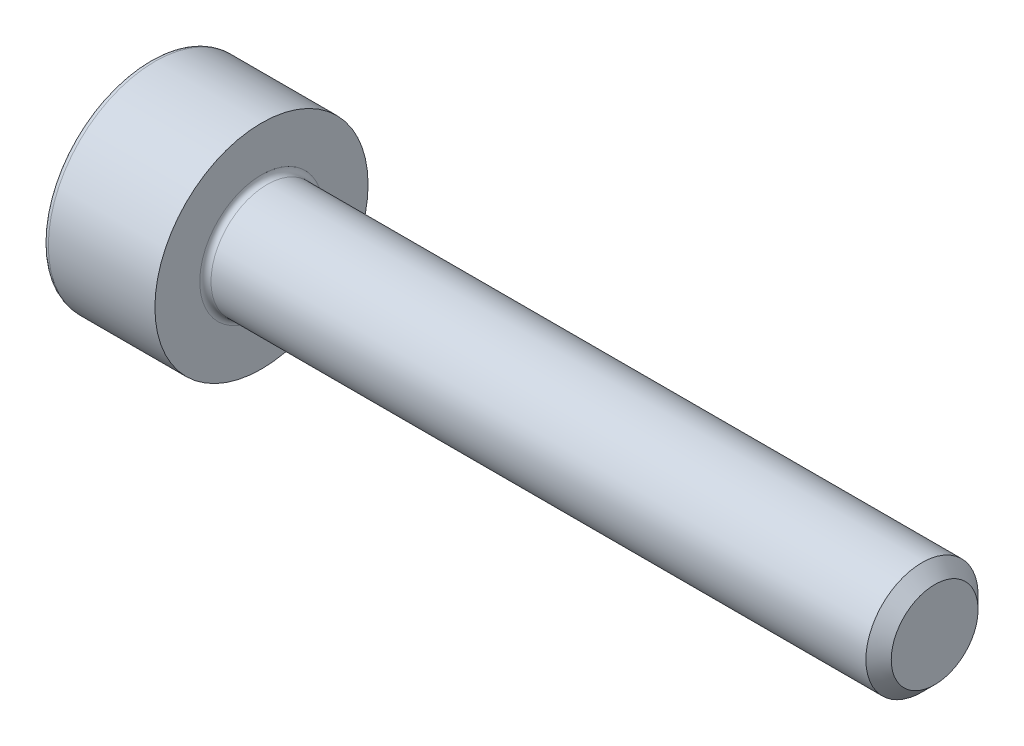
ISO-10303-21;
HEADER;
FILE_DESCRIPTION(('STEP AP214'),'2;1');
FILE_NAME('part.step','',(''),(''),'','','');
FILE_SCHEMA(('AUTOMOTIVE_DESIGN { 1 0 10303 214 1 1 1 1 }'));
ENDSEC;
DATA;
#1=APPLICATION_CONTEXT('core data for automotive mechanical design processes');
#2=APPLICATION_PROTOCOL_DEFINITION('international standard','automotive_design',2000,#1);
#3=PRODUCT_CONTEXT('',#1,'mechanical');
#4=PRODUCT('Part','Part','',(#3));
#5=PRODUCT_RELATED_PRODUCT_CATEGORY('part','',(#4));
#6=PRODUCT_DEFINITION_FORMATION('','',#4);
#7=PRODUCT_DEFINITION_CONTEXT('part definition',#1,'design');
#8=PRODUCT_DEFINITION('design','',#6,#7);
#9=PRODUCT_DEFINITION_SHAPE('','',#8);
#10=(LENGTH_UNIT() NAMED_UNIT(*) SI_UNIT(.MILLI.,.METRE.));
#11=(NAMED_UNIT(*) PLANE_ANGLE_UNIT() SI_UNIT($,.RADIAN.));
#12=(NAMED_UNIT(*) SI_UNIT($,.STERADIAN.) SOLID_ANGLE_UNIT());
#13=UNCERTAINTY_MEASURE_WITH_UNIT(LENGTH_MEASURE(1.E-05),#10,'distance_accuracy_value','');
#14=(GEOMETRIC_REPRESENTATION_CONTEXT(3) GLOBAL_UNCERTAINTY_ASSIGNED_CONTEXT((#13)) GLOBAL_UNIT_ASSIGNED_CONTEXT((#10,
#11,#12)) REPRESENTATION_CONTEXT('',''));
#15=CARTESIAN_POINT('',(0.,0.,0.));
#16=DIRECTION('',(0.,0.,1.));
#17=DIRECTION('',(1.,0.,0.));
#18=AXIS2_PLACEMENT_3D('',#15,#16,#17);
#19=CARTESIAN_POINT('',(0.,0.,0.));
#20=DIRECTION('',(-1.,0.,0.));
#21=DIRECTION('',(0.,0.,1.));
#22=AXIS2_PLACEMENT_3D('',#19,#20,#21);
#23=PLANE('',#22);
#24=DIRECTION('',(0.,-0.5,0.86602540378444));
#25=VECTOR('',#24,1.);
#26=CARTESIAN_POINT('',(0.,0.892006165897967,0.));
#27=LINE('',#26,#25);
#28=CARTESIAN_POINT('',(0.,0.892006165897967,0.));
#29=VERTEX_POINT('',#28);
#30=CARTESIAN_POINT('',(0.,0.446003082948983,0.7725));
#31=VERTEX_POINT('',#30);
#32=EDGE_CURVE('E245',#29,#31,#27,.T.);
#33=ORIENTED_EDGE('',*,*,#32,.T.);
#34=DIRECTION('',(0.,1.,0.));
#35=VECTOR('',#34,1.);
#36=CARTESIAN_POINT('',(0.,-0.446003082948988,0.7725));
#37=LINE('',#36,#35);
#38=CARTESIAN_POINT('',(0.,-0.446003082948988,0.7725));
#39=VERTEX_POINT('',#38);
#40=EDGE_CURVE('E112',#39,#31,#37,.T.);
#41=ORIENTED_EDGE('',*,*,#40,.F.);
#42=DIRECTION('',(0.,-0.5,-0.866025403784438));
#43=VECTOR('',#42,1.);
#44=CARTESIAN_POINT('',(0.,-0.446003082948988,0.7725));
#45=LINE('',#44,#43);
#46=CARTESIAN_POINT('',(0.,-0.892006165897975,0.));
#47=VERTEX_POINT('',#46);
#48=EDGE_CURVE('E248',#39,#47,#45,.T.);
#49=ORIENTED_EDGE('',*,*,#48,.T.);
#50=DIRECTION('',(0.,0.5,-0.86602540378444));
#51=VECTOR('',#50,1.);
#52=CARTESIAN_POINT('',(0.,-0.892006165897975,0.));
#53=LINE('',#52,#51);
#54=CARTESIAN_POINT('',(0.,-0.446003082948991,-0.7725));
#55=VERTEX_POINT('',#54);
#56=EDGE_CURVE('E251',#47,#55,#53,.T.);
#57=ORIENTED_EDGE('',*,*,#56,.T.);
#58=DIRECTION('',(0.,-1.,0.));
#59=VECTOR('',#58,1.);
#60=CARTESIAN_POINT('',(0.,0.44600308294898,-0.7725));
#61=LINE('',#60,#59);
#62=CARTESIAN_POINT('',(0.,0.44600308294898,-0.7725));
#63=VERTEX_POINT('',#62);
#64=EDGE_CURVE('E254',#63,#55,#61,.T.);
#65=ORIENTED_EDGE('',*,*,#64,.F.);
#66=DIRECTION('',(0.,-0.5,-0.866025403784438));
#67=VECTOR('',#66,1.);
#68=CARTESIAN_POINT('',(0.,0.892006165897967,0.));
#69=LINE('',#68,#67);
#70=EDGE_CURVE('E107',#29,#63,#69,.T.);
#71=ORIENTED_EDGE('',*,*,#70,.F.);
#72=EDGE_LOOP('',(#33,#41,#49,#57,#65,#71));
#73=FACE_BOUND('',#72,.T.);
#74=CARTESIAN_POINT('',(0.,0.,0.));
#75=DIRECTION('',(-1.,0.,0.));
#76=DIRECTION('',(0.,0.,1.));
#77=AXIS2_PLACEMENT_3D('',#74,#75,#76);
#78=CIRCLE('',#77,1.8);
#79=CARTESIAN_POINT('',(0.,0.,1.8));
#80=VERTEX_POINT('',#79);
#81=EDGE_CURVE('E24',#80,#80,#78,.T.);
#82=ORIENTED_EDGE('',*,*,#81,.T.);
#83=EDGE_LOOP('',(#82));
#84=FACE_BOUND('',#83,.T.);
#85=ADVANCED_FACE('F16',(#73,#84),#23,.T.);
#86=CARTESIAN_POINT('',(-31.75,0.,0.));
#87=DIRECTION('',(-1.,0.,0.));
#88=DIRECTION('',(0.,0.,1.));
#89=AXIS2_PLACEMENT_3D('',#86,#87,#88);
#90=CYLINDRICAL_SURFACE('',#89,1.9);
#91=CARTESIAN_POINT('',(0.100000000000003,0.,0.));
#92=DIRECTION('',(-1.,0.,0.));
#93=DIRECTION('',(0.,0.,1.));
#94=AXIS2_PLACEMENT_3D('',#91,#92,#93);
#95=CIRCLE('',#94,1.9);
#96=CARTESIAN_POINT('',(0.100000000000003,0.,1.9));
#97=VERTEX_POINT('',#96);
#98=EDGE_CURVE('E10',#97,#97,#95,.F.);
#99=ORIENTED_EDGE('',*,*,#98,.T.);
#100=EDGE_LOOP('',(#99));
#101=FACE_BOUND('',#100,.T.);
#102=CARTESIAN_POINT('',(2.,0.,0.));
#103=DIRECTION('',(-1.,0.,0.));
#104=DIRECTION('',(0.,0.,1.));
#105=AXIS2_PLACEMENT_3D('',#102,#103,#104);
#106=CIRCLE('',#105,1.9);
#107=CARTESIAN_POINT('',(2.,0.,1.9));
#108=VERTEX_POINT('',#107);
#109=EDGE_CURVE('E130',#108,#108,#106,.T.);
#110=ORIENTED_EDGE('',*,*,#109,.T.);
#111=EDGE_LOOP('',(#110));
#112=FACE_BOUND('',#111,.T.);
#113=ADVANCED_FACE('F156',(#101,#112),#90,.T.);
#114=CARTESIAN_POINT('',(2.,1.9,0.));
#115=DIRECTION('',(1.,0.,0.));
#116=DIRECTION('',(0.,0.,-1.));
#117=AXIS2_PLACEMENT_3D('',#114,#115,#116);
#118=PLANE('',#117);
#119=CARTESIAN_POINT('',(2.,0.,0.));
#120=DIRECTION('',(1.,0.,0.));
#121=DIRECTION('',(0.,0.,-1.));
#122=AXIS2_PLACEMENT_3D('',#119,#120,#121);
#123=CIRCLE('',#122,1.1);
#124=CARTESIAN_POINT('',(2.,0.,-1.1));
#125=VERTEX_POINT('',#124);
#126=EDGE_CURVE('E133',#125,#125,#123,.F.);
#127=ORIENTED_EDGE('',*,*,#126,.T.);
#128=EDGE_LOOP('',(#127));
#129=FACE_BOUND('',#128,.T.);
#130=ORIENTED_EDGE('',*,*,#109,.F.);
#131=EDGE_LOOP('',(#130));
#132=FACE_BOUND('',#131,.T.);
#133=ADVANCED_FACE('F163',(#129,#132),#118,.T.);
#134=CARTESIAN_POINT('',(-31.75,0.,0.));
#135=DIRECTION('',(-1.,0.,0.));
#136=DIRECTION('',(0.,0.,1.));
#137=AXIS2_PLACEMENT_3D('',#134,#135,#136);
#138=CYLINDRICAL_SURFACE('',#137,1.);
#139=CARTESIAN_POINT('',(2.1,0.,0.));
#140=DIRECTION('',(1.,0.,0.));
#141=DIRECTION('',(0.,0.,-1.));
#142=AXIS2_PLACEMENT_3D('',#139,#140,#141);
#143=CIRCLE('',#142,1.);
#144=CARTESIAN_POINT('',(2.1,0.,-1.));
#145=VERTEX_POINT('',#144);
#146=EDGE_CURVE('E136',#145,#145,#143,.T.);
#147=ORIENTED_EDGE('',*,*,#146,.T.);
#148=EDGE_LOOP('',(#147));
#149=FACE_BOUND('',#148,.T.);
#150=CARTESIAN_POINT('',(13.774,0.,0.));
#151=DIRECTION('',(-1.,0.,0.));
#152=DIRECTION('',(0.,0.,1.));
#153=AXIS2_PLACEMENT_3D('',#150,#151,#152);
#154=CIRCLE('',#153,0.999999999999986);
#155=CARTESIAN_POINT('',(13.774,0.,0.999999999999986));
#156=VERTEX_POINT('',#155);
#157=EDGE_CURVE('E127',#156,#156,#154,.T.);
#158=ORIENTED_EDGE('',*,*,#157,.T.);
#159=EDGE_LOOP('',(#158));
#160=FACE_BOUND('',#159,.T.);
#161=ADVANCED_FACE('F169',(#149,#160),#138,.T.);
#162=CARTESIAN_POINT('',(14.,0.,0.));
#163=DIRECTION('',(-1.,0.,0.));
#164=DIRECTION('',(0.,0.,1.));
#165=AXIS2_PLACEMENT_3D('',#162,#163,#164);
#166=CONICAL_SURFACE('',#165,0.774,0.785398163397409);
#167=ORIENTED_EDGE('',*,*,#157,.F.);
#168=EDGE_LOOP('',(#167));
#169=FACE_BOUND('',#168,.T.);
#170=CARTESIAN_POINT('',(14.,0.,0.));
#171=DIRECTION('',(-1.,0.,0.));
#172=DIRECTION('',(0.,0.,1.));
#173=AXIS2_PLACEMENT_3D('',#170,#171,#172);
#174=CIRCLE('',#173,0.774);
#175=CARTESIAN_POINT('',(14.,0.,0.774));
#176=VERTEX_POINT('',#175);
#177=EDGE_CURVE('E123',#176,#176,#174,.T.);
#178=ORIENTED_EDGE('',*,*,#177,.T.);
#179=EDGE_LOOP('',(#178));
#180=FACE_BOUND('',#179,.T.);
#181=ADVANCED_FACE('F173',(#169,#180),#166,.T.);
#182=CARTESIAN_POINT('',(14.,0.774,0.));
#183=DIRECTION('',(1.,0.,0.));
#184=DIRECTION('',(0.,0.,-1.));
#185=AXIS2_PLACEMENT_3D('',#182,#183,#184);
#186=PLANE('',#185);
#187=ORIENTED_EDGE('',*,*,#177,.F.);
#188=EDGE_LOOP('',(#187));
#189=FACE_BOUND('',#188,.T.);
#190=ADVANCED_FACE('F152',(#189),#186,.T.);
#191=CARTESIAN_POINT('',(2.1,0.,0.));
#192=DIRECTION('',(1.,0.,0.));
#193=DIRECTION('',(0.,0.,-1.));
#194=AXIS2_PLACEMENT_3D('',#191,#192,#193);
#195=TOROIDAL_SURFACE('',#194,1.1,0.1);
#196=ORIENTED_EDGE('',*,*,#146,.F.);
#197=EDGE_LOOP('',(#196));
#198=FACE_BOUND('',#197,.T.);
#199=ORIENTED_EDGE('',*,*,#126,.F.);
#200=EDGE_LOOP('',(#199));
#201=FACE_BOUND('',#200,.T.);
#202=ADVANCED_FACE('F143',(#198,#201),#195,.F.);
#203=CARTESIAN_POINT('',(0.100000000000003,0.,0.));
#204=DIRECTION('',(-1.,0.,0.));
#205=DIRECTION('',(0.,0.,1.));
#206=AXIS2_PLACEMENT_3D('',#203,#204,#205);
#207=TOROIDAL_SURFACE('',#206,1.8,0.1);
#208=ORIENTED_EDGE('',*,*,#98,.F.);
#209=EDGE_LOOP('',(#208));
#210=FACE_BOUND('',#209,.T.);
#211=ORIENTED_EDGE('',*,*,#81,.F.);
#212=EDGE_LOOP('',(#211));
#213=FACE_BOUND('',#212,.T.);
#214=ADVANCED_FACE('F18',(#210,#213),#207,.T.);
#215=CARTESIAN_POINT('',(1.,0.892006165897967,0.));
#216=DIRECTION('',(0.,-0.86602540378444,-0.5));
#217=DIRECTION('',(0.,0.5,-0.86602540378444));
#218=AXIS2_PLACEMENT_3D('',#215,#216,#217);
#219=PLANE('',#218);
#220=ORIENTED_EDGE('',*,*,#32,.F.);
#221=DIRECTION('',(-1.,0.,0.));
#222=VECTOR('',#221,1.);
#223=CARTESIAN_POINT('',(1.,0.892006165897967,0.));
#224=LINE('',#223,#222);
#225=CARTESIAN_POINT('',(1.,0.892006165897967,0.));
#226=VERTEX_POINT('',#225);
#227=EDGE_CURVE('E235',#226,#29,#224,.T.);
#228=ORIENTED_EDGE('',*,*,#227,.F.);
#229=DIRECTION('',(0.,-0.5,0.86602540378444));
#230=VECTOR('',#229,1.);
#231=CARTESIAN_POINT('',(1.,0.892006165897967,0.));
#232=LINE('',#231,#230);
#233=CARTESIAN_POINT('',(1.,0.669004624423476,0.38625));
#234=VERTEX_POINT('',#233);
#235=EDGE_CURVE('E99',#226,#234,#232,.T.);
#236=ORIENTED_EDGE('',*,*,#235,.T.);
#237=CARTESIAN_POINT('',(1.,0.446003082948983,0.7725));
#238=VERTEX_POINT('',#237);
#239=EDGE_CURVE('E90',#234,#238,#232,.T.);
#240=ORIENTED_EDGE('',*,*,#239,.T.);
#241=DIRECTION('',(-1.,0.,0.));
#242=VECTOR('',#241,1.);
#243=CARTESIAN_POINT('',(1.,0.446003082948983,0.7725));
#244=LINE('',#243,#242);
#245=EDGE_CURVE('E104',#238,#31,#244,.T.);
#246=ORIENTED_EDGE('',*,*,#245,.T.);
#247=EDGE_LOOP('',(#220,#228,#236,#240,#246));
#248=FACE_BOUND('',#247,.T.);
#249=ADVANCED_FACE('F103',(#248),#219,.T.);
#250=CARTESIAN_POINT('',(1.,-0.446003082948988,0.7725));
#251=DIRECTION('',(0.,0.,1.));
#252=DIRECTION('',(0.,-1.,0.));
#253=AXIS2_PLACEMENT_3D('',#250,#251,#252);
#254=PLANE('',#253);
#255=ORIENTED_EDGE('',*,*,#40,.T.);
#256=ORIENTED_EDGE('',*,*,#245,.F.);
#257=DIRECTION('',(0.,1.,0.));
#258=VECTOR('',#257,1.);
#259=CARTESIAN_POINT('',(1.,-0.446003082948988,0.7725));
#260=LINE('',#259,#258);
#261=CARTESIAN_POINT('',(1.,0.,0.7725));
#262=VERTEX_POINT('',#261);
#263=EDGE_CURVE('E87',#262,#238,#260,.T.);
#264=ORIENTED_EDGE('',*,*,#263,.F.);
#265=CARTESIAN_POINT('',(1.,-0.446003082948988,0.7725));
#266=VERTEX_POINT('',#265);
#267=EDGE_CURVE('E98',#266,#262,#260,.T.);
#268=ORIENTED_EDGE('',*,*,#267,.F.);
#269=DIRECTION('',(-1.,0.,0.));
#270=VECTOR('',#269,1.);
#271=CARTESIAN_POINT('',(1.,-0.446003082948988,0.7725));
#272=LINE('',#271,#270);
#273=EDGE_CURVE('E114',#266,#39,#272,.T.);
#274=ORIENTED_EDGE('',*,*,#273,.T.);
#275=EDGE_LOOP('',(#255,#256,#264,#268,#274));
#276=FACE_BOUND('',#275,.T.);
#277=ADVANCED_FACE('F109',(#276),#254,.F.);
#278=CARTESIAN_POINT('',(1.,-0.446003082948988,0.7725));
#279=DIRECTION('',(0.,0.866025403784438,-0.5));
#280=DIRECTION('',(0.,0.5,0.866025403784438));
#281=AXIS2_PLACEMENT_3D('',#278,#279,#280);
#282=PLANE('',#281);
#283=ORIENTED_EDGE('',*,*,#48,.F.);
#284=ORIENTED_EDGE('',*,*,#273,.F.);
#285=DIRECTION('',(0.,-0.5,-0.866025403784438));
#286=VECTOR('',#285,1.);
#287=CARTESIAN_POINT('',(1.,-0.446003082948988,0.7725));
#288=LINE('',#287,#286);
#289=CARTESIAN_POINT('',(1.,-0.66900462442348,0.38625));
#290=VERTEX_POINT('',#289);
#291=EDGE_CURVE('E274',#266,#290,#288,.T.);
#292=ORIENTED_EDGE('',*,*,#291,.T.);
#293=CARTESIAN_POINT('',(1.,-0.892006165897975,0.));
#294=VERTEX_POINT('',#293);
#295=EDGE_CURVE('E263',#290,#294,#288,.T.);
#296=ORIENTED_EDGE('',*,*,#295,.T.);
#297=DIRECTION('',(-1.,0.,0.));
#298=VECTOR('',#297,1.);
#299=CARTESIAN_POINT('',(1.,-0.892006165897975,0.));
#300=LINE('',#299,#298);
#301=EDGE_CURVE('E119',#294,#47,#300,.T.);
#302=ORIENTED_EDGE('',*,*,#301,.T.);
#303=EDGE_LOOP('',(#283,#284,#292,#296,#302));
#304=FACE_BOUND('',#303,.T.);
#305=ADVANCED_FACE('F187',(#304),#282,.T.);
#306=CARTESIAN_POINT('',(1.,-0.892006165897975,0.));
#307=DIRECTION('',(0.,0.86602540378444,0.5));
#308=DIRECTION('',(0.,-0.5,0.86602540378444));
#309=AXIS2_PLACEMENT_3D('',#306,#307,#308);
#310=PLANE('',#309);
#311=ORIENTED_EDGE('',*,*,#56,.F.);
#312=ORIENTED_EDGE('',*,*,#301,.F.);
#313=DIRECTION('',(0.,0.5,-0.86602540378444));
#314=VECTOR('',#313,1.);
#315=CARTESIAN_POINT('',(1.,-0.892006165897975,0.));
#316=LINE('',#315,#314);
#317=CARTESIAN_POINT('',(1.,-0.669004624423484,-0.38625));
#318=VERTEX_POINT('',#317);
#319=EDGE_CURVE('E241',#294,#318,#316,.T.);
#320=ORIENTED_EDGE('',*,*,#319,.T.);
#321=CARTESIAN_POINT('',(1.,-0.446003082948991,-0.7725));
#322=VERTEX_POINT('',#321);
#323=EDGE_CURVE('E273',#318,#322,#316,.T.);
#324=ORIENTED_EDGE('',*,*,#323,.T.);
#325=DIRECTION('',(-1.,0.,0.));
#326=VECTOR('',#325,1.);
#327=CARTESIAN_POINT('',(1.,-0.446003082948991,-0.7725));
#328=LINE('',#327,#326);
#329=EDGE_CURVE('E234',#322,#55,#328,.T.);
#330=ORIENTED_EDGE('',*,*,#329,.T.);
#331=EDGE_LOOP('',(#311,#312,#320,#324,#330));
#332=FACE_BOUND('',#331,.T.);
#333=ADVANCED_FACE('F190',(#332),#310,.T.);
#334=CARTESIAN_POINT('',(1.,0.44600308294898,-0.7725));
#335=DIRECTION('',(0.,0.,-1.));
#336=DIRECTION('',(0.,1.,0.));
#337=AXIS2_PLACEMENT_3D('',#334,#335,#336);
#338=PLANE('',#337);
#339=ORIENTED_EDGE('',*,*,#64,.T.);
#340=ORIENTED_EDGE('',*,*,#329,.F.);
#341=DIRECTION('',(0.,-1.,0.));
#342=VECTOR('',#341,1.);
#343=CARTESIAN_POINT('',(1.,0.44600308294898,-0.7725));
#344=LINE('',#343,#342);
#345=CARTESIAN_POINT('',(1.,0.,-0.7725));
#346=VERTEX_POINT('',#345);
#347=EDGE_CURVE('E238',#346,#322,#344,.T.);
#348=ORIENTED_EDGE('',*,*,#347,.F.);
#349=CARTESIAN_POINT('',(1.,0.44600308294898,-0.7725));
#350=VERTEX_POINT('',#349);
#351=EDGE_CURVE('E31',#350,#346,#344,.T.);
#352=ORIENTED_EDGE('',*,*,#351,.F.);
#353=DIRECTION('',(-1.,0.,0.));
#354=VECTOR('',#353,1.);
#355=CARTESIAN_POINT('',(1.,0.44600308294898,-0.7725));
#356=LINE('',#355,#354);
#357=EDGE_CURVE('E231',#350,#63,#356,.T.);
#358=ORIENTED_EDGE('',*,*,#357,.T.);
#359=EDGE_LOOP('',(#339,#340,#348,#352,#358));
#360=FACE_BOUND('',#359,.T.);
#361=ADVANCED_FACE('F194',(#360),#338,.F.);
#362=CARTESIAN_POINT('',(1.,0.892006165897967,0.));
#363=DIRECTION('',(0.,0.866025403784438,-0.5));
#364=DIRECTION('',(0.,0.5,0.866025403784438));
#365=AXIS2_PLACEMENT_3D('',#362,#363,#364);
#366=PLANE('',#365);
#367=ORIENTED_EDGE('',*,*,#70,.T.);
#368=ORIENTED_EDGE('',*,*,#357,.F.);
#369=DIRECTION('',(0.,-0.5,-0.866025403784438));
#370=VECTOR('',#369,1.);
#371=CARTESIAN_POINT('',(1.,0.892006165897967,0.));
#372=LINE('',#371,#370);
#373=CARTESIAN_POINT('',(1.,0.669004624423476,-0.38625));
#374=VERTEX_POINT('',#373);
#375=EDGE_CURVE('E221',#374,#350,#372,.T.);
#376=ORIENTED_EDGE('',*,*,#375,.F.);
#377=EDGE_CURVE('E227',#226,#374,#372,.T.);
#378=ORIENTED_EDGE('',*,*,#377,.F.);
#379=ORIENTED_EDGE('',*,*,#227,.T.);
#380=EDGE_LOOP('',(#367,#368,#376,#378,#379));
#381=FACE_BOUND('',#380,.T.);
#382=ADVANCED_FACE('F198',(#381),#366,.F.);
#383=CARTESIAN_POINT('',(1.,1.33800924884695,-0.7725));
#384=DIRECTION('',(1.,0.,0.));
#385=DIRECTION('',(0.,0.,-1.));
#386=AXIS2_PLACEMENT_3D('',#383,#384,#385);
#387=PLANE('',#386);
#388=ORIENTED_EDGE('',*,*,#347,.T.);
#389=ORIENTED_EDGE('',*,*,#323,.F.);
#390=CARTESIAN_POINT('',(1.,0.,0.));
#391=DIRECTION('',(-1.,0.,0.));
#392=DIRECTION('',(0.,0.,1.));
#393=AXIS2_PLACEMENT_3D('',#390,#391,#392);
#394=CIRCLE('',#393,0.7725);
#395=EDGE_CURVE('E269',#346,#318,#394,.T.);
#396=ORIENTED_EDGE('',*,*,#395,.F.);
#397=EDGE_LOOP('',(#388,#389,#396));
#398=FACE_BOUND('',#397,.T.);
#399=ADVANCED_FACE('F202',(#398),#387,.F.);
#400=ORIENTED_EDGE('',*,*,#319,.F.);
#401=ORIENTED_EDGE('',*,*,#295,.F.);
#402=EDGE_CURVE('E117',#318,#290,#394,.T.);
#403=ORIENTED_EDGE('',*,*,#402,.F.);
#404=EDGE_LOOP('',(#400,#401,#403));
#405=FACE_BOUND('',#404,.T.);
#406=ADVANCED_FACE('F205',(#405),#387,.F.);
#407=ORIENTED_EDGE('',*,*,#291,.F.);
#408=ORIENTED_EDGE('',*,*,#267,.T.);
#409=EDGE_CURVE('E113',#290,#262,#394,.T.);
#410=ORIENTED_EDGE('',*,*,#409,.F.);
#411=EDGE_LOOP('',(#407,#408,#410));
#412=FACE_BOUND('',#411,.T.);
#413=ADVANCED_FACE('F211',(#412),#387,.F.);
#414=ORIENTED_EDGE('',*,*,#263,.T.);
#415=ORIENTED_EDGE('',*,*,#239,.F.);
#416=EDGE_CURVE('E93',#262,#234,#394,.T.);
#417=ORIENTED_EDGE('',*,*,#416,.F.);
#418=EDGE_LOOP('',(#414,#415,#417));
#419=FACE_BOUND('',#418,.T.);
#420=ADVANCED_FACE('F89',(#419),#387,.F.);
#421=ORIENTED_EDGE('',*,*,#235,.F.);
#422=ORIENTED_EDGE('',*,*,#377,.T.);
#423=EDGE_CURVE('E124',#234,#374,#394,.T.);
#424=ORIENTED_EDGE('',*,*,#423,.F.);
#425=EDGE_LOOP('',(#421,#422,#424));
#426=FACE_BOUND('',#425,.T.);
#427=ADVANCED_FACE('F214',(#426),#387,.F.);
#428=ORIENTED_EDGE('',*,*,#375,.T.);
#429=ORIENTED_EDGE('',*,*,#351,.T.);
#430=EDGE_CURVE('E224',#374,#346,#394,.T.);
#431=ORIENTED_EDGE('',*,*,#430,.F.);
#432=EDGE_LOOP('',(#428,#429,#431));
#433=FACE_BOUND('',#432,.T.);
#434=ADVANCED_FACE('F183',(#433),#387,.F.);
#435=CARTESIAN_POINT('',(1.,0.,0.));
#436=DIRECTION('',(-1.,0.,0.));
#437=DIRECTION('',(0.,0.,1.));
#438=AXIS2_PLACEMENT_3D('',#435,#436,#437);
#439=CONICAL_SURFACE('',#438,0.7725,1.04719755119659);
#440=CARTESIAN_POINT('',(1.446003082949,0.,0.));
#441=VERTEX_POINT('',#440);
#442=VERTEX_LOOP('',#441);
#443=FACE_BOUND('',#442,.T.);
#444=ORIENTED_EDGE('',*,*,#416,.T.);
#445=ORIENTED_EDGE('',*,*,#423,.T.);
#446=ORIENTED_EDGE('',*,*,#430,.T.);
#447=ORIENTED_EDGE('',*,*,#395,.T.);
#448=ORIENTED_EDGE('',*,*,#402,.T.);
#449=ORIENTED_EDGE('',*,*,#409,.T.);
#450=EDGE_LOOP('',(#444,#445,#446,#447,#448,#449));
#451=FACE_BOUND('',#450,.T.);
#452=ADVANCED_FACE('F181',(#443,#451),#439,.F.);
#453=CLOSED_SHELL('',(#85,#113,#133,#161,#181,#190,#202,#214,#249,#277,#305,#333,#361,#382,#399,
#406,#413,#420,#427,#434,#452));
#454=MANIFOLD_SOLID_BREP('B1',#453);
#455=ADVANCED_BREP_SHAPE_REPRESENTATION('',(#18,#454),#14);
#456=SHAPE_DEFINITION_REPRESENTATION(#9,#455);
ENDSEC;
END-ISO-10303-21;
